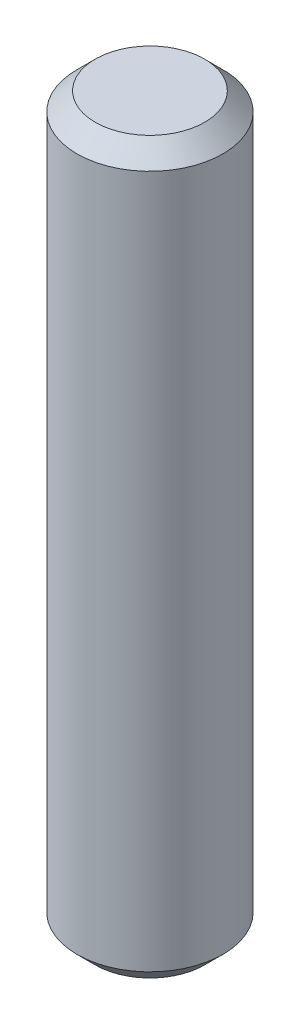
ISO-10303-21;
HEADER;
FILE_DESCRIPTION(('STEP AP214'),'2;1');
FILE_NAME('part.step','',(''),(''),'','','');
FILE_SCHEMA(('AUTOMOTIVE_DESIGN { 1 0 10303 214 1 1 1 1 }'));
ENDSEC;
DATA;
#1=APPLICATION_CONTEXT('core data for automotive mechanical design processes');
#2=APPLICATION_PROTOCOL_DEFINITION('international standard','automotive_design',2000,#1);
#3=PRODUCT_CONTEXT('',#1,'mechanical');
#4=PRODUCT('Part','Part','',(#3));
#5=PRODUCT_RELATED_PRODUCT_CATEGORY('part','',(#4));
#6=PRODUCT_DEFINITION_FORMATION('','',#4);
#7=PRODUCT_DEFINITION_CONTEXT('part definition',#1,'design');
#8=PRODUCT_DEFINITION('design','',#6,#7);
#9=PRODUCT_DEFINITION_SHAPE('','',#8);
#10=(LENGTH_UNIT() NAMED_UNIT(*) SI_UNIT(.MILLI.,.METRE.));
#11=(NAMED_UNIT(*) PLANE_ANGLE_UNIT() SI_UNIT($,.RADIAN.));
#12=(NAMED_UNIT(*) SI_UNIT($,.STERADIAN.) SOLID_ANGLE_UNIT());
#13=UNCERTAINTY_MEASURE_WITH_UNIT(LENGTH_MEASURE(1.E-05),#10,'distance_accuracy_value','');
#14=(GEOMETRIC_REPRESENTATION_CONTEXT(3) GLOBAL_UNCERTAINTY_ASSIGNED_CONTEXT((#13)) GLOBAL_UNIT_ASSIGNED_CONTEXT((#10,
#11,#12)) REPRESENTATION_CONTEXT('',''));
#15=CARTESIAN_POINT('',(0.,0.,0.));
#16=DIRECTION('',(0.,0.,1.));
#17=DIRECTION('',(1.,0.,0.));
#18=AXIS2_PLACEMENT_3D('',#15,#16,#17);
#19=CARTESIAN_POINT('',(0.,20.,0.));
#20=DIRECTION('',(0.,-1.,0.));
#21=DIRECTION('',(0.,0.,-1.));
#22=AXIS2_PLACEMENT_3D('',#19,#20,#21);
#23=CYLINDRICAL_SURFACE('',#22,2.);
#24=CARTESIAN_POINT('',(0.,0.5,0.));
#25=DIRECTION('',(0.,1.,0.));
#26=DIRECTION('',(0.,0.,1.));
#27=AXIS2_PLACEMENT_3D('',#24,#25,#26);
#28=CIRCLE('',#27,2.);
#29=CARTESIAN_POINT('',(0.,0.5,2.));
#30=VERTEX_POINT('',#29);
#31=EDGE_CURVE('E40',#30,#30,#28,.T.);
#32=ORIENTED_EDGE('',*,*,#31,.T.);
#33=EDGE_LOOP('',(#32));
#34=FACE_BOUND('',#33,.T.);
#35=CARTESIAN_POINT('',(0.,19.5,0.));
#36=DIRECTION('',(0.,1.,0.));
#37=DIRECTION('',(0.,0.,1.));
#38=AXIS2_PLACEMENT_3D('',#35,#36,#37);
#39=CIRCLE('',#38,2.);
#40=CARTESIAN_POINT('',(0.,19.5,2.));
#41=VERTEX_POINT('',#40);
#42=EDGE_CURVE('E44',#41,#41,#39,.F.);
#43=ORIENTED_EDGE('',*,*,#42,.T.);
#44=EDGE_LOOP('',(#43));
#45=FACE_BOUND('',#44,.T.);
#46=ADVANCED_FACE('F33',(#34,#45),#23,.T.);
#47=CARTESIAN_POINT('',(0.,20.,0.));
#48=DIRECTION('',(0.,1.,0.));
#49=DIRECTION('',(0.,0.,1.));
#50=AXIS2_PLACEMENT_3D('',#47,#48,#49);
#51=PLANE('',#50);
#52=CARTESIAN_POINT('',(0.,20.,0.));
#53=DIRECTION('',(0.,1.,0.));
#54=DIRECTION('',(0.,0.,1.));
#55=AXIS2_PLACEMENT_3D('',#52,#53,#54);
#56=CIRCLE('',#55,1.5);
#57=CARTESIAN_POINT('',(0.,20.,1.5));
#58=VERTEX_POINT('',#57);
#59=EDGE_CURVE('E48',#58,#58,#56,.T.);
#60=ORIENTED_EDGE('',*,*,#59,.T.);
#61=EDGE_LOOP('',(#60));
#62=FACE_BOUND('',#61,.T.);
#63=ADVANCED_FACE('F54',(#62),#51,.T.);
#64=CARTESIAN_POINT('',(0.,0.,0.));
#65=DIRECTION('',(0.,1.,0.));
#66=DIRECTION('',(0.,0.,1.));
#67=AXIS2_PLACEMENT_3D('',#64,#65,#66);
#68=PLANE('',#67);
#69=CARTESIAN_POINT('',(0.,0.,0.));
#70=DIRECTION('',(0.,1.,0.));
#71=DIRECTION('',(0.,0.,1.));
#72=AXIS2_PLACEMENT_3D('',#69,#70,#71);
#73=CIRCLE('',#72,1.5);
#74=CARTESIAN_POINT('',(0.,0.,1.5));
#75=VERTEX_POINT('',#74);
#76=EDGE_CURVE('E10',#75,#75,#73,.F.);
#77=ORIENTED_EDGE('',*,*,#76,.T.);
#78=EDGE_LOOP('',(#77));
#79=FACE_BOUND('',#78,.T.);
#80=ADVANCED_FACE('F58',(#79),#68,.F.);
#81=CARTESIAN_POINT('',(0.,20.,0.));
#82=DIRECTION('',(0.,-1.,0.));
#83=DIRECTION('',(0.,0.,-1.));
#84=AXIS2_PLACEMENT_3D('',#81,#82,#83);
#85=CONICAL_SURFACE('',#84,1.5,0.785398163397443);
#86=ORIENTED_EDGE('',*,*,#42,.F.);
#87=EDGE_LOOP('',(#86));
#88=FACE_BOUND('',#87,.T.);
#89=ORIENTED_EDGE('',*,*,#59,.F.);
#90=EDGE_LOOP('',(#89));
#91=FACE_BOUND('',#90,.T.);
#92=ADVANCED_FACE('F56',(#88,#91),#85,.T.);
#93=CARTESIAN_POINT('',(0.,0.5,0.));
#94=DIRECTION('',(0.,1.,0.));
#95=DIRECTION('',(0.,0.,1.));
#96=AXIS2_PLACEMENT_3D('',#93,#94,#95);
#97=CONICAL_SURFACE('',#96,2.,0.78539816339745);
#98=ORIENTED_EDGE('',*,*,#76,.F.);
#99=EDGE_LOOP('',(#98));
#100=FACE_BOUND('',#99,.T.);
#101=ORIENTED_EDGE('',*,*,#31,.F.);
#102=EDGE_LOOP('',(#101));
#103=FACE_BOUND('',#102,.T.);
#104=ADVANCED_FACE('F35',(#100,#103),#97,.T.);
#105=CLOSED_SHELL('',(#46,#63,#80,#92,#104));
#106=MANIFOLD_SOLID_BREP('B2',#105);
#107=ADVANCED_BREP_SHAPE_REPRESENTATION('',(#18,#106),#14);
#108=SHAPE_DEFINITION_REPRESENTATION(#9,#107);
ENDSEC;
END-ISO-10303-21;
